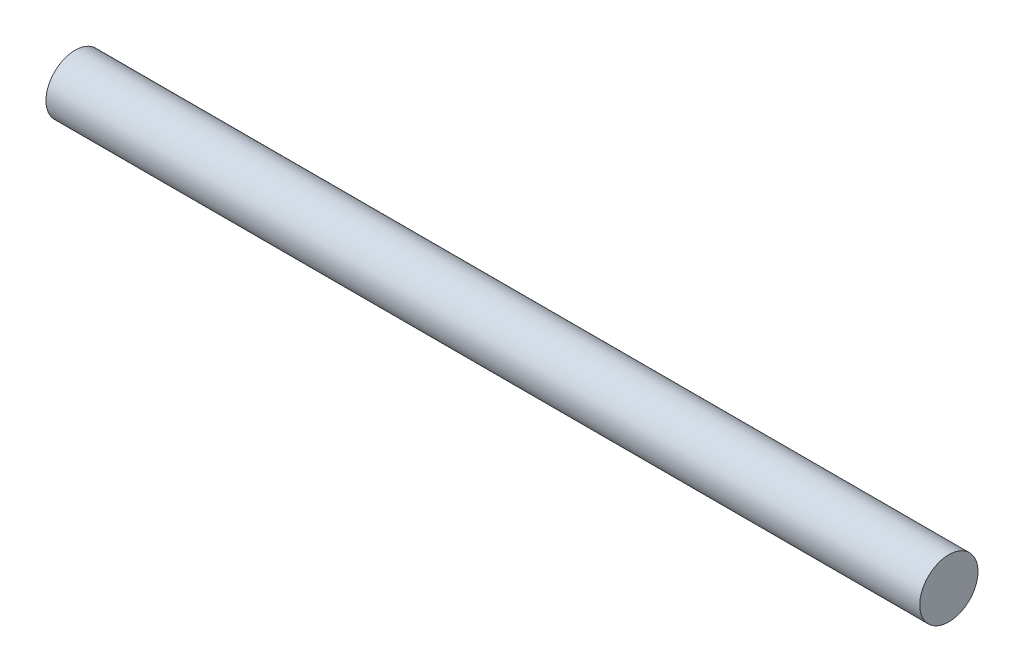
ISO-10303-21;
HEADER;
FILE_DESCRIPTION(('STEP AP214'),'2;1');
FILE_NAME('part.step','',(''),(''),'','','');
FILE_SCHEMA(('AUTOMOTIVE_DESIGN { 1 0 10303 214 1 1 1 1 }'));
ENDSEC;
DATA;
#1=APPLICATION_CONTEXT('core data for automotive mechanical design processes');
#2=APPLICATION_PROTOCOL_DEFINITION('international standard','automotive_design',2000,#1);
#3=PRODUCT_CONTEXT('',#1,'mechanical');
#4=PRODUCT('Part','Part','',(#3));
#5=PRODUCT_RELATED_PRODUCT_CATEGORY('part','',(#4));
#6=PRODUCT_DEFINITION_FORMATION('','',#4);
#7=PRODUCT_DEFINITION_CONTEXT('part definition',#1,'design');
#8=PRODUCT_DEFINITION('design','',#6,#7);
#9=PRODUCT_DEFINITION_SHAPE('','',#8);
#10=(LENGTH_UNIT() NAMED_UNIT(*) SI_UNIT(.MILLI.,.METRE.));
#11=(NAMED_UNIT(*) PLANE_ANGLE_UNIT() SI_UNIT($,.RADIAN.));
#12=(NAMED_UNIT(*) SI_UNIT($,.STERADIAN.) SOLID_ANGLE_UNIT());
#13=UNCERTAINTY_MEASURE_WITH_UNIT(LENGTH_MEASURE(1.E-05),#10,'distance_accuracy_value','');
#14=(GEOMETRIC_REPRESENTATION_CONTEXT(3) GLOBAL_UNCERTAINTY_ASSIGNED_CONTEXT((#13)) GLOBAL_UNIT_ASSIGNED_CONTEXT((#10,
#11,#12)) REPRESENTATION_CONTEXT('',''));
#15=CARTESIAN_POINT('',(0.,0.,0.));
#16=DIRECTION('',(0.,0.,1.));
#17=DIRECTION('',(1.,0.,0.));
#18=AXIS2_PLACEMENT_3D('',#15,#16,#17);
#19=CARTESIAN_POINT('',(75.,0.,0.));
#20=DIRECTION('',(-1.,0.,0.));
#21=DIRECTION('',(0.,0.,1.));
#22=AXIS2_PLACEMENT_3D('',#19,#20,#21);
#23=CYLINDRICAL_SURFACE('',#22,5.);
#24=CARTESIAN_POINT('',(75.,0.,0.));
#25=DIRECTION('',(1.,0.,0.));
#26=DIRECTION('',(0.,0.,-1.));
#27=AXIS2_PLACEMENT_3D('',#24,#25,#26);
#28=CIRCLE('',#27,5.);
#29=CARTESIAN_POINT('',(75.,0.,-5.));
#30=VERTEX_POINT('',#29);
#31=EDGE_CURVE('E10',#30,#30,#28,.T.);
#32=ORIENTED_EDGE('',*,*,#31,.F.);
#33=EDGE_LOOP('',(#32));
#34=FACE_BOUND('',#33,.T.);
#35=CARTESIAN_POINT('',(-75.,0.,0.));
#36=DIRECTION('',(1.,0.,0.));
#37=DIRECTION('',(0.,0.,-1.));
#38=AXIS2_PLACEMENT_3D('',#35,#36,#37);
#39=CIRCLE('',#38,5.);
#40=CARTESIAN_POINT('',(-75.,0.,-5.));
#41=VERTEX_POINT('',#40);
#42=EDGE_CURVE('E42',#41,#41,#39,.T.);
#43=ORIENTED_EDGE('',*,*,#42,.T.);
#44=EDGE_LOOP('',(#43));
#45=FACE_BOUND('',#44,.T.);
#46=ADVANCED_FACE('F39',(#34,#45),#23,.T.);
#47=CARTESIAN_POINT('',(75.,0.,0.));
#48=DIRECTION('',(1.,0.,0.));
#49=DIRECTION('',(0.,0.,-1.));
#50=AXIS2_PLACEMENT_3D('',#47,#48,#49);
#51=PLANE('',#50);
#52=ORIENTED_EDGE('',*,*,#31,.T.);
#53=EDGE_LOOP('',(#52));
#54=FACE_BOUND('',#53,.T.);
#55=ADVANCED_FACE('F56',(#54),#51,.T.);
#56=CARTESIAN_POINT('',(-75.,0.,0.));
#57=DIRECTION('',(1.,0.,0.));
#58=DIRECTION('',(0.,0.,-1.));
#59=AXIS2_PLACEMENT_3D('',#56,#57,#58);
#60=PLANE('',#59);
#61=ORIENTED_EDGE('',*,*,#42,.F.);
#62=EDGE_LOOP('',(#61));
#63=FACE_BOUND('',#62,.T.);
#64=ADVANCED_FACE('F54',(#63),#60,.F.);
#65=CLOSED_SHELL('',(#46,#55,#64));
#66=MANIFOLD_SOLID_BREP('B2',#65);
#67=ADVANCED_BREP_SHAPE_REPRESENTATION('',(#18,#66),#14);
#68=SHAPE_DEFINITION_REPRESENTATION(#9,#67);
ENDSEC;
END-ISO-10303-21;
